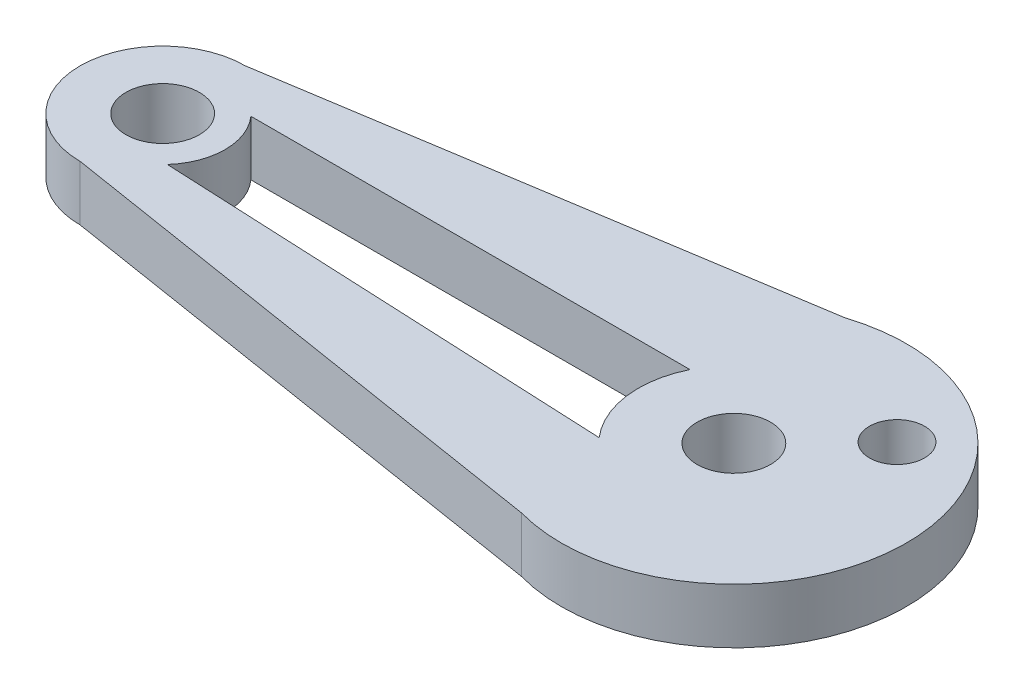
ISO-10303-21;
HEADER;
FILE_DESCRIPTION(('STEP AP214'),'2;1');
FILE_NAME('part.step','',(''),(''),'','','');
FILE_SCHEMA(('AUTOMOTIVE_DESIGN { 1 0 10303 214 1 1 1 1 }'));
ENDSEC;
DATA;
#1=APPLICATION_CONTEXT('core data for automotive mechanical design processes');
#2=APPLICATION_PROTOCOL_DEFINITION('international standard','automotive_design',2000,#1);
#3=PRODUCT_CONTEXT('',#1,'mechanical');
#4=PRODUCT('Part','Part','',(#3));
#5=PRODUCT_RELATED_PRODUCT_CATEGORY('part','',(#4));
#6=PRODUCT_DEFINITION_FORMATION('','',#4);
#7=PRODUCT_DEFINITION_CONTEXT('part definition',#1,'design');
#8=PRODUCT_DEFINITION('design','',#6,#7);
#9=PRODUCT_DEFINITION_SHAPE('','',#8);
#10=(LENGTH_UNIT() NAMED_UNIT(*) SI_UNIT(.MILLI.,.METRE.));
#11=(NAMED_UNIT(*) PLANE_ANGLE_UNIT() SI_UNIT($,.RADIAN.));
#12=(NAMED_UNIT(*) SI_UNIT($,.STERADIAN.) SOLID_ANGLE_UNIT());
#13=UNCERTAINTY_MEASURE_WITH_UNIT(LENGTH_MEASURE(1.E-05),#10,'distance_accuracy_value','');
#14=(GEOMETRIC_REPRESENTATION_CONTEXT(3) GLOBAL_UNCERTAINTY_ASSIGNED_CONTEXT((#13)) GLOBAL_UNIT_ASSIGNED_CONTEXT((#10,
#11,#12)) REPRESENTATION_CONTEXT('',''));
#15=CARTESIAN_POINT('',(0.,0.,0.));
#16=DIRECTION('',(0.,0.,1.));
#17=DIRECTION('',(1.,0.,0.));
#18=AXIS2_PLACEMENT_3D('',#15,#16,#17);
#19=CARTESIAN_POINT('',(-20.6301514382403,3.,9.5027395534472));
#20=DIRECTION('',(0.,1.,0.));
#21=DIRECTION('',(0.,0.,1.));
#22=AXIS2_PLACEMENT_3D('',#19,#20,#21);
#23=PLANE('',#22);
#24=DIRECTION('',(0.998956209962959,0.,0.0456781192305531));
#25=VECTOR('',#24,1.);
#26=CARTESIAN_POINT('',(-49.2020104297136,3.,11.7761737488893));
#27=LINE('',#26,#25);
#28=CARTESIAN_POINT('',(-49.2020104297136,3.,11.7761737488893));
#29=VERTEX_POINT('',#28);
#30=CARTESIAN_POINT('',(-24.5646145528215,3.,12.9027395534472));
#31=VERTEX_POINT('',#30);
#32=EDGE_CURVE('E106',#29,#31,#27,.T.);
#33=ORIENTED_EDGE('',*,*,#32,.F.);
#34=CARTESIAN_POINT('',(-51.7301514382403,3.,9.5027395534472));
#35=DIRECTION('',(0.,-1.,0.));
#36=DIRECTION('',(0.,0.,1.));
#37=AXIS2_PLACEMENT_3D('',#34,#35,#36);
#38=CIRCLE('',#37,3.4);
#39=CARTESIAN_POINT('',(-49.2020104297136,3.,7.22930535800509));
#40=VERTEX_POINT('',#39);
#41=EDGE_CURVE('E98',#40,#29,#38,.T.);
#42=ORIENTED_EDGE('',*,*,#41,.F.);
#43=DIRECTION('',(-0.999999913758063,0.,0.000415311771255232));
#44=VECTOR('',#43,1.);
#45=CARTESIAN_POINT('',(-49.2020104297136,3.,7.22930535800509));
#46=LINE('',#45,#44);
#47=CARTESIAN_POINT('',(-25.3020104297136,3.,7.21937940581605));
#48=VERTEX_POINT('',#47);
#49=EDGE_CURVE('E121',#48,#40,#46,.T.);
#50=ORIENTED_EDGE('',*,*,#49,.F.);
#51=CARTESIAN_POINT('',(-20.6301514382403,3.,9.5027395534472));
#52=DIRECTION('',(0.,-1.,0.));
#53=DIRECTION('',(0.,0.,1.));
#54=AXIS2_PLACEMENT_3D('',#51,#52,#53);
#55=CIRCLE('',#54,5.2);
#56=EDGE_CURVE('E119',#31,#48,#55,.T.);
#57=ORIENTED_EDGE('',*,*,#56,.F.);
#58=EDGE_LOOP('',(#33,#42,#50,#57));
#59=FACE_BOUND('',#58,.T.);
#60=CARTESIAN_POINT('',(-20.6301514382403,3.,9.5027395534472));
#61=DIRECTION('',(0.,1.,0.));
#62=DIRECTION('',(0.,0.,1.));
#63=AXIS2_PLACEMENT_3D('',#60,#61,#62);
#64=CIRCLE('',#63,2.);
#65=CARTESIAN_POINT('',(-20.6301514382403,3.,11.5027395534472));
#66=VERTEX_POINT('',#65);
#67=EDGE_CURVE('E143',#66,#66,#64,.T.);
#68=ORIENTED_EDGE('',*,*,#67,.F.);
#69=EDGE_LOOP('',(#68));
#70=FACE_BOUND('',#69,.T.);
#71=CARTESIAN_POINT('',(-20.6301514382403,3.,9.5027395534472));
#72=DIRECTION('',(0.,1.,0.));
#73=DIRECTION('',(0.,0.,1.));
#74=AXIS2_PLACEMENT_3D('',#71,#72,#73);
#75=CIRCLE('',#74,9.4);
#76=CARTESIAN_POINT('',(-23.1301514382403,3.,18.5641963899609));
#77=VERTEX_POINT('',#76);
#78=CARTESIAN_POINT('',(-23.5204603504899,3.,0.558125845087813));
#79=VERTEX_POINT('',#78);
#80=EDGE_CURVE('E149',#77,#79,#75,.T.);
#81=ORIENTED_EDGE('',*,*,#80,.T.);
#82=DIRECTION('',(-0.987814418255136,0.,0.155636355287787));
#83=VECTOR('',#82,1.);
#84=CARTESIAN_POINT('',(-51.7301514382403,3.,5.0027395534472));
#85=LINE('',#84,#83);
#86=CARTESIAN_POINT('',(-51.7301514382403,3.,5.0027395534472));
#87=VERTEX_POINT('',#86);
#88=EDGE_CURVE('E152',#79,#87,#85,.T.);
#89=ORIENTED_EDGE('',*,*,#88,.T.);
#90=CARTESIAN_POINT('',(-51.7301514382403,3.,9.5027395534472));
#91=DIRECTION('',(0.,1.,0.));
#92=DIRECTION('',(0.,0.,1.));
#93=AXIS2_PLACEMENT_3D('',#90,#91,#92);
#94=CIRCLE('',#93,4.5);
#95=CARTESIAN_POINT('',(-51.7301514382403,3.,14.0027395534472));
#96=VERTEX_POINT('',#95);
#97=EDGE_CURVE('E155',#87,#96,#94,.T.);
#98=ORIENTED_EDGE('',*,*,#97,.T.);
#99=DIRECTION('',(0.987518849923489,0.,0.157500860460475));
#100=VECTOR('',#99,1.);
#101=CARTESIAN_POINT('',(-51.7301514382403,3.,14.0027395534472));
#102=LINE('',#101,#100);
#103=EDGE_CURVE('E157',#96,#77,#102,.T.);
#104=ORIENTED_EDGE('',*,*,#103,.T.);
#105=EDGE_LOOP('',(#81,#89,#98,#104));
#106=FACE_BOUND('',#105,.T.);
#107=CARTESIAN_POINT('',(-16.2470193213047,3.,5.0027395534472));
#108=DIRECTION('',(0.,1.,0.));
#109=DIRECTION('',(0.,0.,1.));
#110=AXIS2_PLACEMENT_3D('',#107,#108,#109);
#111=CIRCLE('',#110,1.5);
#112=CARTESIAN_POINT('',(-16.2470193213047,3.,6.5027395534472));
#113=VERTEX_POINT('',#112);
#114=EDGE_CURVE('E137',#113,#113,#111,.T.);
#115=ORIENTED_EDGE('',*,*,#114,.F.);
#116=EDGE_LOOP('',(#115));
#117=FACE_BOUND('',#116,.T.);
#118=CARTESIAN_POINT('',(-51.7301514382403,3.,9.5027395534472));
#119=DIRECTION('',(0.,1.,0.));
#120=DIRECTION('',(0.,0.,1.));
#121=AXIS2_PLACEMENT_3D('',#118,#119,#120);
#122=CIRCLE('',#121,2.);
#123=CARTESIAN_POINT('',(-51.7301514382403,3.,11.5027395534472));
#124=VERTEX_POINT('',#123);
#125=EDGE_CURVE('E127',#124,#124,#122,.T.);
#126=ORIENTED_EDGE('',*,*,#125,.F.);
#127=EDGE_LOOP('',(#126));
#128=FACE_BOUND('',#127,.T.);
#129=ADVANCED_FACE('F33',(#59,#70,#106,#117,#128),#23,.T.);
#130=CARTESIAN_POINT('',(-20.6301514382403,0.,9.5027395534472));
#131=DIRECTION('',(0.,1.,0.));
#132=DIRECTION('',(0.,0.,1.));
#133=AXIS2_PLACEMENT_3D('',#130,#131,#132);
#134=PLANE('',#133);
#135=CARTESIAN_POINT('',(-51.7301514382403,0.,9.5027395534472));
#136=DIRECTION('',(0.,-1.,0.));
#137=DIRECTION('',(0.,0.,1.));
#138=AXIS2_PLACEMENT_3D('',#135,#136,#137);
#139=CIRCLE('',#138,3.4);
#140=CARTESIAN_POINT('',(-49.2020104297136,0.,7.22930535800509));
#141=VERTEX_POINT('',#140);
#142=CARTESIAN_POINT('',(-49.2020104297136,0.,11.7761737488893));
#143=VERTEX_POINT('',#142);
#144=EDGE_CURVE('E56',#141,#143,#139,.T.);
#145=ORIENTED_EDGE('',*,*,#144,.T.);
#146=DIRECTION('',(0.998956209962959,0.,0.0456781192305531));
#147=VECTOR('',#146,1.);
#148=CARTESIAN_POINT('',(-49.2020104297136,0.,11.7761737488893));
#149=LINE('',#148,#147);
#150=CARTESIAN_POINT('',(-24.5646145528215,0.,12.9027395534472));
#151=VERTEX_POINT('',#150);
#152=EDGE_CURVE('E113',#143,#151,#149,.T.);
#153=ORIENTED_EDGE('',*,*,#152,.T.);
#154=CARTESIAN_POINT('',(-20.6301514382403,0.,9.5027395534472));
#155=DIRECTION('',(0.,-1.,0.));
#156=DIRECTION('',(0.,0.,1.));
#157=AXIS2_PLACEMENT_3D('',#154,#155,#156);
#158=CIRCLE('',#157,5.2);
#159=CARTESIAN_POINT('',(-25.3020104297136,0.,7.21937940581605));
#160=VERTEX_POINT('',#159);
#161=EDGE_CURVE('E129',#151,#160,#158,.T.);
#162=ORIENTED_EDGE('',*,*,#161,.T.);
#163=DIRECTION('',(-0.999999913758063,0.,0.000415311771255232));
#164=VECTOR('',#163,1.);
#165=CARTESIAN_POINT('',(-49.2020104297136,0.,7.22930535800509));
#166=LINE('',#165,#164);
#167=EDGE_CURVE('E107',#160,#141,#166,.T.);
#168=ORIENTED_EDGE('',*,*,#167,.T.);
#169=EDGE_LOOP('',(#145,#153,#162,#168));
#170=FACE_BOUND('',#169,.T.);
#171=CARTESIAN_POINT('',(-20.6301514382403,0.,9.5027395534472));
#172=DIRECTION('',(0.,1.,0.));
#173=DIRECTION('',(0.,0.,1.));
#174=AXIS2_PLACEMENT_3D('',#171,#172,#173);
#175=CIRCLE('',#174,2.);
#176=CARTESIAN_POINT('',(-20.6301514382403,0.,11.5027395534472));
#177=VERTEX_POINT('',#176);
#178=EDGE_CURVE('E140',#177,#177,#175,.T.);
#179=ORIENTED_EDGE('',*,*,#178,.T.);
#180=EDGE_LOOP('',(#179));
#181=FACE_BOUND('',#180,.T.);
#182=CARTESIAN_POINT('',(-20.6301514382403,0.,9.5027395534472));
#183=DIRECTION('',(0.,1.,0.));
#184=DIRECTION('',(0.,0.,1.));
#185=AXIS2_PLACEMENT_3D('',#182,#183,#184);
#186=CIRCLE('',#185,9.4);
#187=CARTESIAN_POINT('',(-23.1301514382403,0.,18.5641963899609));
#188=VERTEX_POINT('',#187);
#189=CARTESIAN_POINT('',(-23.5204603504899,0.,0.558125845087813));
#190=VERTEX_POINT('',#189);
#191=EDGE_CURVE('E146',#188,#190,#186,.T.);
#192=ORIENTED_EDGE('',*,*,#191,.F.);
#193=DIRECTION('',(0.987518849923489,0.,0.157500860460475));
#194=VECTOR('',#193,1.);
#195=CARTESIAN_POINT('',(-51.7301514382403,0.,14.0027395534472));
#196=LINE('',#195,#194);
#197=CARTESIAN_POINT('',(-51.7301514382403,0.,14.0027395534472));
#198=VERTEX_POINT('',#197);
#199=EDGE_CURVE('E153',#198,#188,#196,.T.);
#200=ORIENTED_EDGE('',*,*,#199,.F.);
#201=CARTESIAN_POINT('',(-51.7301514382403,0.,9.5027395534472));
#202=DIRECTION('',(0.,1.,0.));
#203=DIRECTION('',(0.,0.,1.));
#204=AXIS2_PLACEMENT_3D('',#201,#202,#203);
#205=CIRCLE('',#204,4.5);
#206=CARTESIAN_POINT('',(-51.7301514382403,0.,5.0027395534472));
#207=VERTEX_POINT('',#206);
#208=EDGE_CURVE('E164',#207,#198,#205,.T.);
#209=ORIENTED_EDGE('',*,*,#208,.F.);
#210=DIRECTION('',(-0.987814418255136,0.,0.155636355287787));
#211=VECTOR('',#210,1.);
#212=CARTESIAN_POINT('',(-51.7301514382403,0.,5.0027395534472));
#213=LINE('',#212,#211);
#214=EDGE_CURVE('E162',#190,#207,#213,.T.);
#215=ORIENTED_EDGE('',*,*,#214,.F.);
#216=EDGE_LOOP('',(#192,#200,#209,#215));
#217=FACE_BOUND('',#216,.T.);
#218=CARTESIAN_POINT('',(-16.2470193213047,0.,5.0027395534472));
#219=DIRECTION('',(0.,1.,0.));
#220=DIRECTION('',(0.,0.,1.));
#221=AXIS2_PLACEMENT_3D('',#218,#219,#220);
#222=CIRCLE('',#221,1.5);
#223=CARTESIAN_POINT('',(-16.2470193213047,0.,6.5027395534472));
#224=VERTEX_POINT('',#223);
#225=EDGE_CURVE('E114',#224,#224,#222,.T.);
#226=ORIENTED_EDGE('',*,*,#225,.T.);
#227=EDGE_LOOP('',(#226));
#228=FACE_BOUND('',#227,.T.);
#229=CARTESIAN_POINT('',(-51.7301514382403,0.,9.5027395534472));
#230=DIRECTION('',(0.,1.,0.));
#231=DIRECTION('',(0.,0.,1.));
#232=AXIS2_PLACEMENT_3D('',#229,#230,#231);
#233=CIRCLE('',#232,2.);
#234=CARTESIAN_POINT('',(-51.7301514382403,0.,11.5027395534472));
#235=VERTEX_POINT('',#234);
#236=EDGE_CURVE('E250',#235,#235,#233,.T.);
#237=ORIENTED_EDGE('',*,*,#236,.T.);
#238=EDGE_LOOP('',(#237));
#239=FACE_BOUND('',#238,.T.);
#240=ADVANCED_FACE('F182',(#170,#181,#217,#228,#239),#134,.F.);
#241=CARTESIAN_POINT('',(-20.6301514382403,3.,9.5027395534472));
#242=DIRECTION('',(0.,-1.,0.));
#243=DIRECTION('',(0.,0.,-1.));
#244=AXIS2_PLACEMENT_3D('',#241,#242,#243);
#245=CYLINDRICAL_SURFACE('',#244,9.4);
#246=ORIENTED_EDGE('',*,*,#191,.T.);
#247=DIRECTION('',(0.,-1.,0.));
#248=VECTOR('',#247,1.);
#249=CARTESIAN_POINT('',(-23.5204603504899,3.,0.558125845087813));
#250=LINE('',#249,#248);
#251=EDGE_CURVE('E11',#79,#190,#250,.T.);
#252=ORIENTED_EDGE('',*,*,#251,.F.);
#253=ORIENTED_EDGE('',*,*,#80,.F.);
#254=DIRECTION('',(0.,-1.,0.));
#255=VECTOR('',#254,1.);
#256=CARTESIAN_POINT('',(-23.1301514382403,3.,18.5641963899609));
#257=LINE('',#256,#255);
#258=EDGE_CURVE('E159',#77,#188,#257,.T.);
#259=ORIENTED_EDGE('',*,*,#258,.T.);
#260=EDGE_LOOP('',(#246,#252,#253,#259));
#261=FACE_BOUND('',#260,.T.);
#262=ADVANCED_FACE('F35',(#261),#245,.T.);
#263=CARTESIAN_POINT('',(-51.7301514382403,3.,5.0027395534472));
#264=DIRECTION('',(0.155636355287787,0.,0.987814418255137));
#265=DIRECTION('',(0.987814418255137,0.,-0.155636355287787));
#266=AXIS2_PLACEMENT_3D('',#263,#264,#265);
#267=PLANE('',#266);
#268=ORIENTED_EDGE('',*,*,#214,.T.);
#269=DIRECTION('',(0.,-1.,0.));
#270=VECTOR('',#269,1.);
#271=CARTESIAN_POINT('',(-51.7301514382403,3.,5.0027395534472));
#272=LINE('',#271,#270);
#273=EDGE_CURVE('E41',#87,#207,#272,.T.);
#274=ORIENTED_EDGE('',*,*,#273,.F.);
#275=ORIENTED_EDGE('',*,*,#88,.F.);
#276=ORIENTED_EDGE('',*,*,#251,.T.);
#277=EDGE_LOOP('',(#268,#274,#275,#276));
#278=FACE_BOUND('',#277,.T.);
#279=ADVANCED_FACE('F193',(#278),#267,.F.);
#280=CARTESIAN_POINT('',(-51.7301514382403,3.,9.5027395534472));
#281=DIRECTION('',(0.,-1.,0.));
#282=DIRECTION('',(0.,0.,-1.));
#283=AXIS2_PLACEMENT_3D('',#280,#281,#282);
#284=CYLINDRICAL_SURFACE('',#283,4.5);
#285=ORIENTED_EDGE('',*,*,#208,.T.);
#286=DIRECTION('',(0.,-1.,0.));
#287=VECTOR('',#286,1.);
#288=CARTESIAN_POINT('',(-51.7301514382403,3.,14.0027395534472));
#289=LINE('',#288,#287);
#290=EDGE_CURVE('E169',#96,#198,#289,.T.);
#291=ORIENTED_EDGE('',*,*,#290,.F.);
#292=ORIENTED_EDGE('',*,*,#97,.F.);
#293=ORIENTED_EDGE('',*,*,#273,.T.);
#294=EDGE_LOOP('',(#285,#291,#292,#293));
#295=FACE_BOUND('',#294,.T.);
#296=ADVANCED_FACE('F176',(#295),#284,.T.);
#297=CARTESIAN_POINT('',(-51.7301514382403,3.,14.0027395534472));
#298=DIRECTION('',(0.157500860460475,0.,-0.987518849923489));
#299=DIRECTION('',(-0.987518849923489,0.,-0.157500860460475));
#300=AXIS2_PLACEMENT_3D('',#297,#298,#299);
#301=PLANE('',#300);
#302=ORIENTED_EDGE('',*,*,#199,.T.);
#303=ORIENTED_EDGE('',*,*,#258,.F.);
#304=ORIENTED_EDGE('',*,*,#103,.F.);
#305=ORIENTED_EDGE('',*,*,#290,.T.);
#306=EDGE_LOOP('',(#302,#303,#304,#305));
#307=FACE_BOUND('',#306,.T.);
#308=ADVANCED_FACE('F186',(#307),#301,.F.);
#309=CARTESIAN_POINT('',(-20.6301514382403,3.,9.5027395534472));
#310=DIRECTION('',(0.,-1.,0.));
#311=DIRECTION('',(0.,0.,-1.));
#312=AXIS2_PLACEMENT_3D('',#309,#310,#311);
#313=CYLINDRICAL_SURFACE('',#312,2.);
#314=ORIENTED_EDGE('',*,*,#67,.T.);
#315=EDGE_LOOP('',(#314));
#316=FACE_BOUND('',#315,.T.);
#317=ORIENTED_EDGE('',*,*,#178,.F.);
#318=EDGE_LOOP('',(#317));
#319=FACE_BOUND('',#318,.T.);
#320=ADVANCED_FACE('F208',(#316,#319),#313,.F.);
#321=CARTESIAN_POINT('',(-16.2470193213047,3.,5.0027395534472));
#322=DIRECTION('',(0.,-1.,0.));
#323=DIRECTION('',(0.,0.,-1.));
#324=AXIS2_PLACEMENT_3D('',#321,#322,#323);
#325=CYLINDRICAL_SURFACE('',#324,1.5);
#326=ORIENTED_EDGE('',*,*,#114,.T.);
#327=EDGE_LOOP('',(#326));
#328=FACE_BOUND('',#327,.T.);
#329=ORIENTED_EDGE('',*,*,#225,.F.);
#330=EDGE_LOOP('',(#329));
#331=FACE_BOUND('',#330,.T.);
#332=ADVANCED_FACE('F215',(#328,#331),#325,.F.);
#333=CARTESIAN_POINT('',(-51.7301514382403,3.,9.5027395534472));
#334=DIRECTION('',(0.,-1.,0.));
#335=DIRECTION('',(0.,0.,-1.));
#336=AXIS2_PLACEMENT_3D('',#333,#334,#335);
#337=CYLINDRICAL_SURFACE('',#336,3.4);
#338=ORIENTED_EDGE('',*,*,#144,.F.);
#339=DIRECTION('',(0.,-1.,0.));
#340=VECTOR('',#339,1.);
#341=CARTESIAN_POINT('',(-49.2020104297136,3.,7.22930535800509));
#342=LINE('',#341,#340);
#343=EDGE_CURVE('E102',#40,#141,#342,.T.);
#344=ORIENTED_EDGE('',*,*,#343,.F.);
#345=ORIENTED_EDGE('',*,*,#41,.T.);
#346=DIRECTION('',(0.,-1.,0.));
#347=VECTOR('',#346,1.);
#348=CARTESIAN_POINT('',(-49.2020104297136,3.,11.7761737488893));
#349=LINE('',#348,#347);
#350=EDGE_CURVE('E101',#29,#143,#349,.T.);
#351=ORIENTED_EDGE('',*,*,#350,.T.);
#352=EDGE_LOOP('',(#338,#344,#345,#351));
#353=FACE_BOUND('',#352,.T.);
#354=ADVANCED_FACE('F100',(#353),#337,.T.);
#355=CARTESIAN_POINT('',(-49.2020104297136,3.,11.7761737488893));
#356=DIRECTION('',(0.0456781192305531,0.,-0.998956209962959));
#357=DIRECTION('',(-0.998956209962959,0.,-0.0456781192305531));
#358=AXIS2_PLACEMENT_3D('',#355,#356,#357);
#359=PLANE('',#358);
#360=ORIENTED_EDGE('',*,*,#152,.F.);
#361=ORIENTED_EDGE('',*,*,#350,.F.);
#362=ORIENTED_EDGE('',*,*,#32,.T.);
#363=DIRECTION('',(0.,-1.,0.));
#364=VECTOR('',#363,1.);
#365=CARTESIAN_POINT('',(-24.5646145528215,3.,12.9027395534472));
#366=LINE('',#365,#364);
#367=EDGE_CURVE('E115',#31,#151,#366,.T.);
#368=ORIENTED_EDGE('',*,*,#367,.T.);
#369=EDGE_LOOP('',(#360,#361,#362,#368));
#370=FACE_BOUND('',#369,.T.);
#371=ADVANCED_FACE('F110',(#370),#359,.T.);
#372=CARTESIAN_POINT('',(-20.6301514382403,3.,9.5027395534472));
#373=DIRECTION('',(0.,-1.,0.));
#374=DIRECTION('',(0.,0.,-1.));
#375=AXIS2_PLACEMENT_3D('',#372,#373,#374);
#376=CYLINDRICAL_SURFACE('',#375,5.2);
#377=ORIENTED_EDGE('',*,*,#161,.F.);
#378=ORIENTED_EDGE('',*,*,#367,.F.);
#379=ORIENTED_EDGE('',*,*,#56,.T.);
#380=DIRECTION('',(0.,-1.,0.));
#381=VECTOR('',#380,1.);
#382=CARTESIAN_POINT('',(-25.3020104297136,3.,7.21937940581605));
#383=LINE('',#382,#381);
#384=EDGE_CURVE('E48',#48,#160,#383,.T.);
#385=ORIENTED_EDGE('',*,*,#384,.T.);
#386=EDGE_LOOP('',(#377,#378,#379,#385));
#387=FACE_BOUND('',#386,.T.);
#388=ADVANCED_FACE('F233',(#387),#376,.T.);
#389=CARTESIAN_POINT('',(-49.2020104297136,3.,7.22930535800509));
#390=DIRECTION('',(0.000415311771255232,0.,0.999999913758063));
#391=DIRECTION('',(0.999999913758063,0.,-0.000415311771255232));
#392=AXIS2_PLACEMENT_3D('',#389,#390,#391);
#393=PLANE('',#392);
#394=ORIENTED_EDGE('',*,*,#167,.F.);
#395=ORIENTED_EDGE('',*,*,#384,.F.);
#396=ORIENTED_EDGE('',*,*,#49,.T.);
#397=ORIENTED_EDGE('',*,*,#343,.T.);
#398=EDGE_LOOP('',(#394,#395,#396,#397));
#399=FACE_BOUND('',#398,.T.);
#400=ADVANCED_FACE('F236',(#399),#393,.T.);
#401=CARTESIAN_POINT('',(-51.7301514382403,3.,9.5027395534472));
#402=DIRECTION('',(0.,-1.,0.));
#403=DIRECTION('',(0.,0.,-1.));
#404=AXIS2_PLACEMENT_3D('',#401,#402,#403);
#405=CYLINDRICAL_SURFACE('',#404,2.);
#406=ORIENTED_EDGE('',*,*,#125,.T.);
#407=EDGE_LOOP('',(#406));
#408=FACE_BOUND('',#407,.T.);
#409=ORIENTED_EDGE('',*,*,#236,.F.);
#410=EDGE_LOOP('',(#409));
#411=FACE_BOUND('',#410,.T.);
#412=ADVANCED_FACE('F240',(#408,#411),#405,.F.);
#413=CLOSED_SHELL('',(#129,#240,#262,#279,#296,#308,#320,#332,#354,#371,#388,#400,#412));
#414=MANIFOLD_SOLID_BREP('B2',#413);
#415=ADVANCED_BREP_SHAPE_REPRESENTATION('',(#18,#414),#14);
#416=SHAPE_DEFINITION_REPRESENTATION(#9,#415);
ENDSEC;
END-ISO-10303-21;
